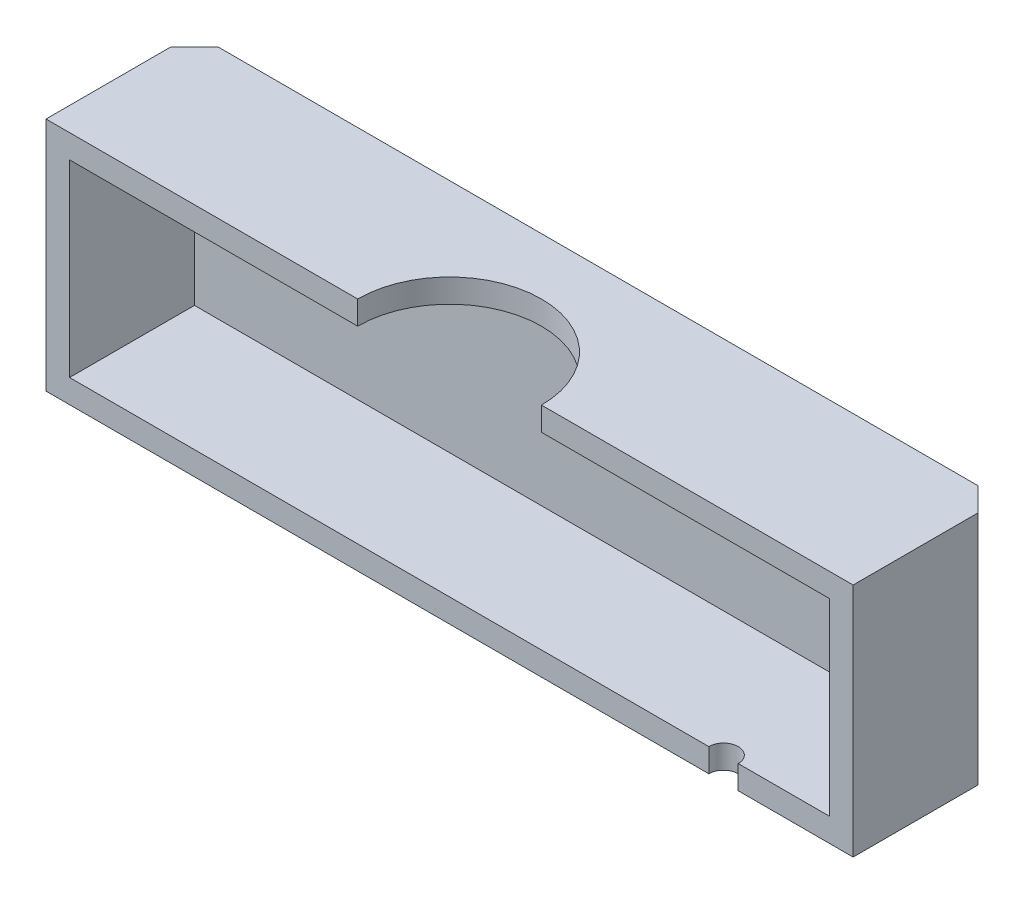
ISO-10303-21;
HEADER;
FILE_DESCRIPTION(('STEP AP214'),'2;1');
FILE_NAME('part.step','',(''),(''),'','','');
FILE_SCHEMA(('AUTOMOTIVE_DESIGN { 1 0 10303 214 1 1 1 1 }'));
ENDSEC;
DATA;
#1=APPLICATION_CONTEXT('core data for automotive mechanical design processes');
#2=APPLICATION_PROTOCOL_DEFINITION('international standard','automotive_design',2000,#1);
#3=PRODUCT_CONTEXT('',#1,'mechanical');
#4=PRODUCT('Part','Part','',(#3));
#5=PRODUCT_RELATED_PRODUCT_CATEGORY('part','',(#4));
#6=PRODUCT_DEFINITION_FORMATION('','',#4);
#7=PRODUCT_DEFINITION_CONTEXT('part definition',#1,'design');
#8=PRODUCT_DEFINITION('design','',#6,#7);
#9=PRODUCT_DEFINITION_SHAPE('','',#8);
#10=(LENGTH_UNIT() NAMED_UNIT(*) SI_UNIT(.MILLI.,.METRE.));
#11=(NAMED_UNIT(*) PLANE_ANGLE_UNIT() SI_UNIT($,.RADIAN.));
#12=(NAMED_UNIT(*) SI_UNIT($,.STERADIAN.) SOLID_ANGLE_UNIT());
#13=UNCERTAINTY_MEASURE_WITH_UNIT(LENGTH_MEASURE(1.E-05),#10,'distance_accuracy_value','');
#14=(GEOMETRIC_REPRESENTATION_CONTEXT(3) GLOBAL_UNCERTAINTY_ASSIGNED_CONTEXT((#13)) GLOBAL_UNIT_ASSIGNED_CONTEXT((#10,
#11,#12)) REPRESENTATION_CONTEXT('',''));
#15=CARTESIAN_POINT('',(0.,0.,0.));
#16=DIRECTION('',(0.,0.,1.));
#17=DIRECTION('',(1.,0.,0.));
#18=AXIS2_PLACEMENT_3D('',#15,#16,#17);
#19=CARTESIAN_POINT('',(86.995,-0.00999999999999959,-16.002));
#20=DIRECTION('',(0.,0.,-1.));
#21=DIRECTION('',(-1.,0.,0.));
#22=AXIS2_PLACEMENT_3D('',#19,#20,#21);
#23=PLANE('',#22);
#24=DIRECTION('',(-1.,0.,0.));
#25=VECTOR('',#24,1.);
#26=CARTESIAN_POINT('',(111.498545921347,22.86,-16.002));
#27=LINE('',#26,#25);
#28=CARTESIAN_POINT('',(84.455,22.86,-16.002));
#29=VERTEX_POINT('',#28);
#30=CARTESIAN_POINT('',(53.4035,22.86,-16.002));
#31=VERTEX_POINT('',#30);
#32=EDGE_CURVE('E218',#29,#31,#27,.T.);
#33=ORIENTED_EDGE('',*,*,#32,.F.);
#34=DIRECTION('',(0.,1.,0.));
#35=VECTOR('',#34,1.);
#36=CARTESIAN_POINT('',(84.455,2.54,-16.002));
#37=LINE('',#36,#35);
#38=CARTESIAN_POINT('',(84.455,2.54,-16.002));
#39=VERTEX_POINT('',#38);
#40=EDGE_CURVE('E217',#39,#29,#37,.T.);
#41=ORIENTED_EDGE('',*,*,#40,.F.);
#42=DIRECTION('',(1.,0.,0.));
#43=VECTOR('',#42,1.);
#44=CARTESIAN_POINT('',(0.,2.54,-16.002));
#45=LINE('',#44,#43);
#46=CARTESIAN_POINT('',(74.6125,2.54,-16.002));
#47=VERTEX_POINT('',#46);
#48=EDGE_CURVE('E143',#47,#39,#45,.T.);
#49=ORIENTED_EDGE('',*,*,#48,.F.);
#50=DIRECTION('',(0.,-1.,0.));
#51=VECTOR('',#50,1.);
#52=CARTESIAN_POINT('',(74.6125,2.54,-16.002));
#53=LINE('',#52,#51);
#54=CARTESIAN_POINT('',(74.6125,0.,-16.002));
#55=VERTEX_POINT('',#54);
#56=EDGE_CURVE('E203',#55,#47,#53,.F.);
#57=ORIENTED_EDGE('',*,*,#56,.F.);
#58=DIRECTION('',(1.,0.,0.));
#59=VECTOR('',#58,1.);
#60=CARTESIAN_POINT('',(0.,0.,-16.002));
#61=LINE('',#60,#59);
#62=CARTESIAN_POINT('',(86.995,0.,-16.002));
#63=VERTEX_POINT('',#62);
#64=EDGE_CURVE('E11',#55,#63,#61,.T.);
#65=ORIENTED_EDGE('',*,*,#64,.T.);
#66=DIRECTION('',(0.,-1.,0.));
#67=VECTOR('',#66,1.);
#68=CARTESIAN_POINT('',(86.995,25.4,-16.002));
#69=LINE('',#68,#67);
#70=CARTESIAN_POINT('',(86.995,25.4,-16.002));
#71=VERTEX_POINT('',#70);
#72=EDGE_CURVE('E48',#71,#63,#69,.T.);
#73=ORIENTED_EDGE('',*,*,#72,.F.);
#74=DIRECTION('',(1.,0.,0.));
#75=VECTOR('',#74,1.);
#76=CARTESIAN_POINT('',(0.,25.4,-16.002));
#77=LINE('',#76,#75);
#78=CARTESIAN_POINT('',(53.4035,25.4,-16.002));
#79=VERTEX_POINT('',#78);
#80=EDGE_CURVE('E206',#79,#71,#77,.T.);
#81=ORIENTED_EDGE('',*,*,#80,.F.);
#82=DIRECTION('',(0.,1.,0.));
#83=VECTOR('',#82,1.);
#84=CARTESIAN_POINT('',(53.4035,22.86,-16.002));
#85=LINE('',#84,#83);
#86=EDGE_CURVE('E35',#31,#79,#85,.T.);
#87=ORIENTED_EDGE('',*,*,#86,.F.);
#88=EDGE_LOOP('',(#33,#41,#49,#57,#65,#73,#81,#87));
#89=FACE_BOUND('',#88,.T.);
#90=ADVANCED_FACE('F32',(#89),#23,.F.);
#91=CARTESIAN_POINT('',(0.,25.4,-16.002));
#92=VERTEX_POINT('',#91);
#93=CARTESIAN_POINT('',(33.5915,25.4,-16.002));
#94=VERTEX_POINT('',#93);
#95=EDGE_CURVE('E208',#92,#94,#77,.T.);
#96=ORIENTED_EDGE('',*,*,#95,.F.);
#97=DIRECTION('',(0.,1.,0.));
#98=VECTOR('',#97,1.);
#99=CARTESIAN_POINT('',(0.,25.4,-16.002));
#100=LINE('',#99,#98);
#101=CARTESIAN_POINT('',(0.,0.,-16.002));
#102=VERTEX_POINT('',#101);
#103=EDGE_CURVE('E211',#102,#92,#100,.T.);
#104=ORIENTED_EDGE('',*,*,#103,.F.);
#105=CARTESIAN_POINT('',(71.4375,0.,-16.002));
#106=VERTEX_POINT('',#105);
#107=EDGE_CURVE('E40',#102,#106,#61,.T.);
#108=ORIENTED_EDGE('',*,*,#107,.T.);
#109=DIRECTION('',(0.,-1.,0.));
#110=VECTOR('',#109,1.);
#111=CARTESIAN_POINT('',(71.4375,2.54,-16.002));
#112=LINE('',#111,#110);
#113=CARTESIAN_POINT('',(71.4375,2.54,-16.002));
#114=VERTEX_POINT('',#113);
#115=EDGE_CURVE('E201',#114,#106,#112,.T.);
#116=ORIENTED_EDGE('',*,*,#115,.F.);
#117=CARTESIAN_POINT('',(2.54,2.54,-16.002));
#118=VERTEX_POINT('',#117);
#119=EDGE_CURVE('E213',#118,#114,#45,.T.);
#120=ORIENTED_EDGE('',*,*,#119,.F.);
#121=DIRECTION('',(0.,-1.,0.));
#122=VECTOR('',#121,1.);
#123=CARTESIAN_POINT('',(2.54,2.54,-16.002));
#124=LINE('',#123,#122);
#125=CARTESIAN_POINT('',(2.54,22.86,-16.002));
#126=VERTEX_POINT('',#125);
#127=EDGE_CURVE('E205',#126,#118,#124,.T.);
#128=ORIENTED_EDGE('',*,*,#127,.F.);
#129=CARTESIAN_POINT('',(33.5915,22.86,-16.002));
#130=VERTEX_POINT('',#129);
#131=EDGE_CURVE('E214',#130,#126,#27,.T.);
#132=ORIENTED_EDGE('',*,*,#131,.F.);
#133=DIRECTION('',(0.,1.,0.));
#134=VECTOR('',#133,1.);
#135=CARTESIAN_POINT('',(33.5915,22.86,-16.002));
#136=LINE('',#135,#134);
#137=EDGE_CURVE('E209',#94,#130,#136,.F.);
#138=ORIENTED_EDGE('',*,*,#137,.F.);
#139=EDGE_LOOP('',(#96,#104,#108,#116,#120,#128,#132,#138));
#140=FACE_BOUND('',#139,.T.);
#141=ADVANCED_FACE('F274',(#140),#23,.F.);
#142=CARTESIAN_POINT('',(86.995,25.4,0.));
#143=DIRECTION('',(-1.,0.,0.));
#144=DIRECTION('',(0.,0.,1.));
#145=AXIS2_PLACEMENT_3D('',#142,#143,#144);
#146=PLANE('',#145);
#147=DIRECTION('',(0.,0.,-1.));
#148=VECTOR('',#147,1.);
#149=CARTESIAN_POINT('',(86.995,25.4,0.));
#150=LINE('',#149,#148);
#151=CARTESIAN_POINT('',(86.995,25.4,-29.464));
#152=VERTEX_POINT('',#151);
#153=EDGE_CURVE('E169',#71,#152,#150,.T.);
#154=ORIENTED_EDGE('',*,*,#153,.F.);
#155=ORIENTED_EDGE('',*,*,#72,.T.);
#156=DIRECTION('',(0.,0.,-1.));
#157=VECTOR('',#156,1.);
#158=CARTESIAN_POINT('',(86.995,0.,0.));
#159=LINE('',#158,#157);
#160=CARTESIAN_POINT('',(86.995,0.,-29.464));
#161=VERTEX_POINT('',#160);
#162=EDGE_CURVE('E178',#63,#161,#159,.T.);
#163=ORIENTED_EDGE('',*,*,#162,.T.);
#164=DIRECTION('',(0.,1.,0.));
#165=VECTOR('',#164,1.);
#166=CARTESIAN_POINT('',(86.995,25.4,-29.464));
#167=LINE('',#166,#165);
#168=EDGE_CURVE('E175',#161,#152,#167,.T.);
#169=ORIENTED_EDGE('',*,*,#168,.T.);
#170=EDGE_LOOP('',(#154,#155,#163,#169));
#171=FACE_BOUND('',#170,.T.);
#172=ADVANCED_FACE('F253',(#171),#146,.F.);
#173=CARTESIAN_POINT('',(84.455,25.4,-32.004));
#174=DIRECTION('',(-0.70710678118655,0.,0.707106781186546));
#175=DIRECTION('',(0.,-1.,0.));
#176=AXIS2_PLACEMENT_3D('',#173,#174,#175);
#177=PLANE('',#176);
#178=DIRECTION('',(0.707106781186546,0.,0.70710678118655));
#179=VECTOR('',#178,1.);
#180=CARTESIAN_POINT('',(84.455,25.4,-32.004));
#181=LINE('',#180,#179);
#182=CARTESIAN_POINT('',(84.455,25.4,-32.004));
#183=VERTEX_POINT('',#182);
#184=EDGE_CURVE('E191',#152,#183,#181,.F.);
#185=ORIENTED_EDGE('',*,*,#184,.F.);
#186=ORIENTED_EDGE('',*,*,#168,.F.);
#187=DIRECTION('',(-0.707106781186546,0.,-0.70710678118655));
#188=VECTOR('',#187,1.);
#189=CARTESIAN_POINT('',(58.2295000000002,0.,-58.2294999999999));
#190=LINE('',#189,#188);
#191=CARTESIAN_POINT('',(84.455,0.,-32.004));
#192=VERTEX_POINT('',#191);
#193=EDGE_CURVE('E186',#192,#161,#190,.F.);
#194=ORIENTED_EDGE('',*,*,#193,.F.);
#195=DIRECTION('',(0.,-1.,0.));
#196=VECTOR('',#195,1.);
#197=CARTESIAN_POINT('',(84.455,25.4,-32.004));
#198=LINE('',#197,#196);
#199=EDGE_CURVE('E195',#183,#192,#198,.T.);
#200=ORIENTED_EDGE('',*,*,#199,.F.);
#201=EDGE_LOOP('',(#185,#186,#194,#200));
#202=FACE_BOUND('',#201,.T.);
#203=ADVANCED_FACE('F257',(#202),#177,.F.);
#204=CARTESIAN_POINT('',(0.,25.4,-32.004));
#205=DIRECTION('',(0.,0.,1.));
#206=DIRECTION('',(1.,0.,0.));
#207=AXIS2_PLACEMENT_3D('',#204,#205,#206);
#208=PLANE('',#207);
#209=DIRECTION('',(-1.,0.,0.));
#210=VECTOR('',#209,1.);
#211=CARTESIAN_POINT('',(0.,25.4,-32.004));
#212=LINE('',#211,#210);
#213=CARTESIAN_POINT('',(2.54000000000001,25.4,-32.004));
#214=VERTEX_POINT('',#213);
#215=EDGE_CURVE('E172',#183,#214,#212,.T.);
#216=ORIENTED_EDGE('',*,*,#215,.F.);
#217=ORIENTED_EDGE('',*,*,#199,.T.);
#218=DIRECTION('',(-1.,0.,0.));
#219=VECTOR('',#218,1.);
#220=CARTESIAN_POINT('',(0.,0.,-32.004));
#221=LINE('',#220,#219);
#222=CARTESIAN_POINT('',(2.54000000000001,0.,-32.004));
#223=VERTEX_POINT('',#222);
#224=EDGE_CURVE('E170',#192,#223,#221,.T.);
#225=ORIENTED_EDGE('',*,*,#224,.T.);
#226=DIRECTION('',(0.,1.,0.));
#227=VECTOR('',#226,1.);
#228=CARTESIAN_POINT('',(2.54000000000001,25.4,-32.004));
#229=LINE('',#228,#227);
#230=EDGE_CURVE('E193',#223,#214,#229,.T.);
#231=ORIENTED_EDGE('',*,*,#230,.T.);
#232=EDGE_LOOP('',(#216,#217,#225,#231));
#233=FACE_BOUND('',#232,.T.);
#234=ADVANCED_FACE('F263',(#233),#208,.F.);
#235=CARTESIAN_POINT('',(0.,25.4,-29.464));
#236=DIRECTION('',(0.707106781186546,0.,0.70710678118655));
#237=DIRECTION('',(0.,-1.,0.));
#238=AXIS2_PLACEMENT_3D('',#235,#236,#237);
#239=PLANE('',#238);
#240=DIRECTION('',(0.70710678118655,0.,-0.707106781186546));
#241=VECTOR('',#240,1.);
#242=CARTESIAN_POINT('',(0.,25.4,-29.464));
#243=LINE('',#242,#241);
#244=CARTESIAN_POINT('',(0.,25.4,-29.464));
#245=VERTEX_POINT('',#244);
#246=EDGE_CURVE('E189',#214,#245,#243,.F.);
#247=ORIENTED_EDGE('',*,*,#246,.F.);
#248=ORIENTED_EDGE('',*,*,#230,.F.);
#249=DIRECTION('',(-0.70710678118655,0.,0.707106781186546));
#250=VECTOR('',#249,1.);
#251=CARTESIAN_POINT('',(-14.732,0.,-14.7320000000001));
#252=LINE('',#251,#250);
#253=CARTESIAN_POINT('',(0.,0.,-29.464));
#254=VERTEX_POINT('',#253);
#255=EDGE_CURVE('E184',#254,#223,#252,.F.);
#256=ORIENTED_EDGE('',*,*,#255,.F.);
#257=DIRECTION('',(0.,-1.,0.));
#258=VECTOR('',#257,1.);
#259=CARTESIAN_POINT('',(0.,25.4,-29.464));
#260=LINE('',#259,#258);
#261=EDGE_CURVE('E198',#245,#254,#260,.T.);
#262=ORIENTED_EDGE('',*,*,#261,.F.);
#263=EDGE_LOOP('',(#247,#248,#256,#262));
#264=FACE_BOUND('',#263,.T.);
#265=ADVANCED_FACE('F266',(#264),#239,.F.);
#266=CARTESIAN_POINT('',(0.,25.4,0.));
#267=DIRECTION('',(1.,0.,0.));
#268=DIRECTION('',(0.,0.,-1.));
#269=AXIS2_PLACEMENT_3D('',#266,#267,#268);
#270=PLANE('',#269);
#271=DIRECTION('',(0.,0.,1.));
#272=VECTOR('',#271,1.);
#273=CARTESIAN_POINT('',(0.,0.,0.));
#274=LINE('',#273,#272);
#275=EDGE_CURVE('E164',#254,#102,#274,.T.);
#276=ORIENTED_EDGE('',*,*,#275,.T.);
#277=ORIENTED_EDGE('',*,*,#103,.T.);
#278=DIRECTION('',(0.,0.,1.));
#279=VECTOR('',#278,1.);
#280=CARTESIAN_POINT('',(0.,25.4,0.));
#281=LINE('',#280,#279);
#282=EDGE_CURVE('E166',#245,#92,#281,.T.);
#283=ORIENTED_EDGE('',*,*,#282,.F.);
#284=ORIENTED_EDGE('',*,*,#261,.T.);
#285=EDGE_LOOP('',(#276,#277,#283,#284));
#286=FACE_BOUND('',#285,.T.);
#287=ADVANCED_FACE('F271',(#286),#270,.F.);
#288=CARTESIAN_POINT('',(0.,25.4,0.));
#289=DIRECTION('',(0.,-1.,0.));
#290=DIRECTION('',(0.,0.,-1.));
#291=AXIS2_PLACEMENT_3D('',#288,#289,#290);
#292=PLANE('',#291);
#293=ORIENTED_EDGE('',*,*,#282,.T.);
#294=ORIENTED_EDGE('',*,*,#95,.T.);
#295=CARTESIAN_POINT('',(43.4975,25.4,-16.002));
#296=DIRECTION('',(0.,1.,0.));
#297=DIRECTION('',(0.,0.,1.));
#298=AXIS2_PLACEMENT_3D('',#295,#296,#297);
#299=CIRCLE('',#298,9.906);
#300=EDGE_CURVE('E235',#79,#94,#299,.T.);
#301=ORIENTED_EDGE('',*,*,#300,.F.);
#302=ORIENTED_EDGE('',*,*,#80,.T.);
#303=ORIENTED_EDGE('',*,*,#153,.T.);
#304=ORIENTED_EDGE('',*,*,#184,.T.);
#305=ORIENTED_EDGE('',*,*,#215,.T.);
#306=ORIENTED_EDGE('',*,*,#246,.T.);
#307=EDGE_LOOP('',(#293,#294,#301,#302,#303,#304,#305,#306));
#308=FACE_BOUND('',#307,.T.);
#309=ADVANCED_FACE('F260',(#308),#292,.F.);
#310=CARTESIAN_POINT('',(43.4975,22.86,-16.002));
#311=DIRECTION('',(0.,1.,0.));
#312=DIRECTION('',(0.,0.,1.));
#313=AXIS2_PLACEMENT_3D('',#310,#311,#312);
#314=CYLINDRICAL_SURFACE('',#313,9.906);
#315=ORIENTED_EDGE('',*,*,#300,.T.);
#316=ORIENTED_EDGE('',*,*,#137,.T.);
#317=CARTESIAN_POINT('',(43.4975,22.86,-16.002));
#318=DIRECTION('',(0.,1.,0.));
#319=DIRECTION('',(0.,0.,1.));
#320=AXIS2_PLACEMENT_3D('',#317,#318,#319);
#321=CIRCLE('',#320,9.906);
#322=EDGE_CURVE('E234',#31,#130,#321,.T.);
#323=ORIENTED_EDGE('',*,*,#322,.F.);
#324=ORIENTED_EDGE('',*,*,#86,.T.);
#325=EDGE_LOOP('',(#315,#316,#323,#324));
#326=FACE_BOUND('',#325,.T.);
#327=ADVANCED_FACE('F278',(#326),#314,.F.);
#328=CARTESIAN_POINT('',(2.54,2.54,-29.464));
#329=DIRECTION('',(0.,0.,-1.));
#330=DIRECTION('',(-1.,0.,0.));
#331=AXIS2_PLACEMENT_3D('',#328,#329,#330);
#332=PLANE('',#331);
#333=DIRECTION('',(-1.,0.,0.));
#334=VECTOR('',#333,1.);
#335=CARTESIAN_POINT('',(111.498545921347,22.86,-29.464));
#336=LINE('',#335,#334);
#337=CARTESIAN_POINT('',(84.455,22.86,-29.464));
#338=VERTEX_POINT('',#337);
#339=CARTESIAN_POINT('',(2.54,22.86,-29.464));
#340=VERTEX_POINT('',#339);
#341=EDGE_CURVE('E228',#338,#340,#336,.T.);
#342=ORIENTED_EDGE('',*,*,#341,.T.);
#343=DIRECTION('',(0.,1.,0.));
#344=VECTOR('',#343,1.);
#345=CARTESIAN_POINT('',(2.54,2.54,-29.464));
#346=LINE('',#345,#344);
#347=CARTESIAN_POINT('',(2.54,2.54,-29.464));
#348=VERTEX_POINT('',#347);
#349=EDGE_CURVE('E156',#348,#340,#346,.T.);
#350=ORIENTED_EDGE('',*,*,#349,.F.);
#351=DIRECTION('',(-1.,0.,0.));
#352=VECTOR('',#351,1.);
#353=CARTESIAN_POINT('',(2.54,2.54,-29.464));
#354=LINE('',#353,#352);
#355=CARTESIAN_POINT('',(84.455,2.54,-29.464));
#356=VERTEX_POINT('',#355);
#357=EDGE_CURVE('E140',#356,#348,#354,.T.);
#358=ORIENTED_EDGE('',*,*,#357,.F.);
#359=DIRECTION('',(0.,1.,0.));
#360=VECTOR('',#359,1.);
#361=CARTESIAN_POINT('',(84.455,2.54,-29.464));
#362=LINE('',#361,#360);
#363=EDGE_CURVE('E149',#356,#338,#362,.T.);
#364=ORIENTED_EDGE('',*,*,#363,.T.);
#365=EDGE_LOOP('',(#342,#350,#358,#364));
#366=FACE_BOUND('',#365,.T.);
#367=ADVANCED_FACE('F158',(#366),#332,.F.);
#368=CARTESIAN_POINT('',(0.,2.54,0.));
#369=DIRECTION('',(0.,-1.,0.));
#370=DIRECTION('',(0.,0.,-1.));
#371=AXIS2_PLACEMENT_3D('',#368,#369,#370);
#372=PLANE('',#371);
#373=DIRECTION('',(0.,0.,1.));
#374=VECTOR('',#373,1.);
#375=CARTESIAN_POINT('',(2.54,2.54,-2.54));
#376=LINE('',#375,#374);
#377=EDGE_CURVE('E146',#348,#118,#376,.T.);
#378=ORIENTED_EDGE('',*,*,#377,.T.);
#379=ORIENTED_EDGE('',*,*,#119,.T.);
#380=CARTESIAN_POINT('',(73.025,2.54,-16.002));
#381=DIRECTION('',(0.,-1.,0.));
#382=DIRECTION('',(0.,0.,-1.));
#383=AXIS2_PLACEMENT_3D('',#380,#381,#382);
#384=CIRCLE('',#383,1.5875);
#385=EDGE_CURVE('E238',#114,#47,#384,.T.);
#386=ORIENTED_EDGE('',*,*,#385,.T.);
#387=ORIENTED_EDGE('',*,*,#48,.T.);
#388=DIRECTION('',(0.,0.,-1.));
#389=VECTOR('',#388,1.);
#390=CARTESIAN_POINT('',(84.455,2.54,-2.54));
#391=LINE('',#390,#389);
#392=EDGE_CURVE('E135',#39,#356,#391,.T.);
#393=ORIENTED_EDGE('',*,*,#392,.T.);
#394=ORIENTED_EDGE('',*,*,#357,.T.);
#395=EDGE_LOOP('',(#378,#379,#386,#387,#393,#394));
#396=FACE_BOUND('',#395,.T.);
#397=ADVANCED_FACE('F138',(#396),#372,.F.);
#398=CARTESIAN_POINT('',(0.,0.,0.));
#399=DIRECTION('',(0.,-1.,0.));
#400=DIRECTION('',(0.,0.,-1.));
#401=AXIS2_PLACEMENT_3D('',#398,#399,#400);
#402=PLANE('',#401);
#403=ORIENTED_EDGE('',*,*,#107,.F.);
#404=ORIENTED_EDGE('',*,*,#275,.F.);
#405=ORIENTED_EDGE('',*,*,#255,.T.);
#406=ORIENTED_EDGE('',*,*,#224,.F.);
#407=ORIENTED_EDGE('',*,*,#193,.T.);
#408=ORIENTED_EDGE('',*,*,#162,.F.);
#409=ORIENTED_EDGE('',*,*,#64,.F.);
#410=CARTESIAN_POINT('',(73.025,0.,-16.002));
#411=DIRECTION('',(0.,-1.,0.));
#412=DIRECTION('',(0.,0.,-1.));
#413=AXIS2_PLACEMENT_3D('',#410,#411,#412);
#414=CIRCLE('',#413,1.5875);
#415=EDGE_CURVE('E240',#106,#55,#414,.T.);
#416=ORIENTED_EDGE('',*,*,#415,.F.);
#417=EDGE_LOOP('',(#403,#404,#405,#406,#407,#408,#409,#416));
#418=FACE_BOUND('',#417,.T.);
#419=ADVANCED_FACE('F250',(#418),#402,.T.);
#420=CARTESIAN_POINT('',(73.025,2.54,-16.002));
#421=DIRECTION('',(0.,-1.,0.));
#422=DIRECTION('',(0.,0.,-1.));
#423=AXIS2_PLACEMENT_3D('',#420,#421,#422);
#424=CYLINDRICAL_SURFACE('',#423,1.5875);
#425=ORIENTED_EDGE('',*,*,#415,.T.);
#426=ORIENTED_EDGE('',*,*,#56,.T.);
#427=ORIENTED_EDGE('',*,*,#385,.F.);
#428=ORIENTED_EDGE('',*,*,#115,.T.);
#429=EDGE_LOOP('',(#425,#426,#427,#428));
#430=FACE_BOUND('',#429,.T.);
#431=ADVANCED_FACE('F247',(#430),#424,.F.);
#432=CARTESIAN_POINT('',(111.498545921347,22.86,-29.464));
#433=DIRECTION('',(0.,1.,0.));
#434=DIRECTION('',(0.,0.,1.));
#435=AXIS2_PLACEMENT_3D('',#432,#433,#434);
#436=PLANE('',#435);
#437=DIRECTION('',(0.,0.,-1.));
#438=VECTOR('',#437,1.);
#439=CARTESIAN_POINT('',(84.455,22.86,-29.464));
#440=LINE('',#439,#438);
#441=EDGE_CURVE('E152',#29,#338,#440,.T.);
#442=ORIENTED_EDGE('',*,*,#441,.F.);
#443=ORIENTED_EDGE('',*,*,#32,.T.);
#444=ORIENTED_EDGE('',*,*,#322,.T.);
#445=ORIENTED_EDGE('',*,*,#131,.T.);
#446=DIRECTION('',(0.,0.,-1.));
#447=VECTOR('',#446,1.);
#448=CARTESIAN_POINT('',(2.54,22.86,-29.464));
#449=LINE('',#448,#447);
#450=EDGE_CURVE('E229',#126,#340,#449,.T.);
#451=ORIENTED_EDGE('',*,*,#450,.T.);
#452=ORIENTED_EDGE('',*,*,#341,.F.);
#453=EDGE_LOOP('',(#442,#443,#444,#445,#451,#452));
#454=FACE_BOUND('',#453,.T.);
#455=ADVANCED_FACE('F227',(#454),#436,.F.);
#456=CARTESIAN_POINT('',(2.54,2.54,-2.54));
#457=DIRECTION('',(-1.,0.,0.));
#458=DIRECTION('',(0.,0.,1.));
#459=AXIS2_PLACEMENT_3D('',#456,#457,#458);
#460=PLANE('',#459);
#461=ORIENTED_EDGE('',*,*,#450,.F.);
#462=ORIENTED_EDGE('',*,*,#127,.T.);
#463=ORIENTED_EDGE('',*,*,#377,.F.);
#464=ORIENTED_EDGE('',*,*,#349,.T.);
#465=EDGE_LOOP('',(#461,#462,#463,#464));
#466=FACE_BOUND('',#465,.T.);
#467=ADVANCED_FACE('F282',(#466),#460,.F.);
#468=CARTESIAN_POINT('',(84.455,2.54,-2.54));
#469=DIRECTION('',(1.,0.,0.));
#470=DIRECTION('',(0.,0.,-1.));
#471=AXIS2_PLACEMENT_3D('',#468,#469,#470);
#472=PLANE('',#471);
#473=ORIENTED_EDGE('',*,*,#392,.F.);
#474=ORIENTED_EDGE('',*,*,#40,.T.);
#475=ORIENTED_EDGE('',*,*,#441,.T.);
#476=ORIENTED_EDGE('',*,*,#363,.F.);
#477=EDGE_LOOP('',(#473,#474,#475,#476));
#478=FACE_BOUND('',#477,.T.);
#479=ADVANCED_FACE('F150',(#478),#472,.F.);
#480=CLOSED_SHELL('',(#90,#141,#172,#203,#234,#265,#287,#309,#327,#367,#397,#419,#431,#455,#467,#479));
#481=MANIFOLD_SOLID_BREP('B2',#480);
#482=ADVANCED_BREP_SHAPE_REPRESENTATION('',(#18,#481),#14);
#483=SHAPE_DEFINITION_REPRESENTATION(#9,#482);
ENDSEC;
END-ISO-10303-21;
